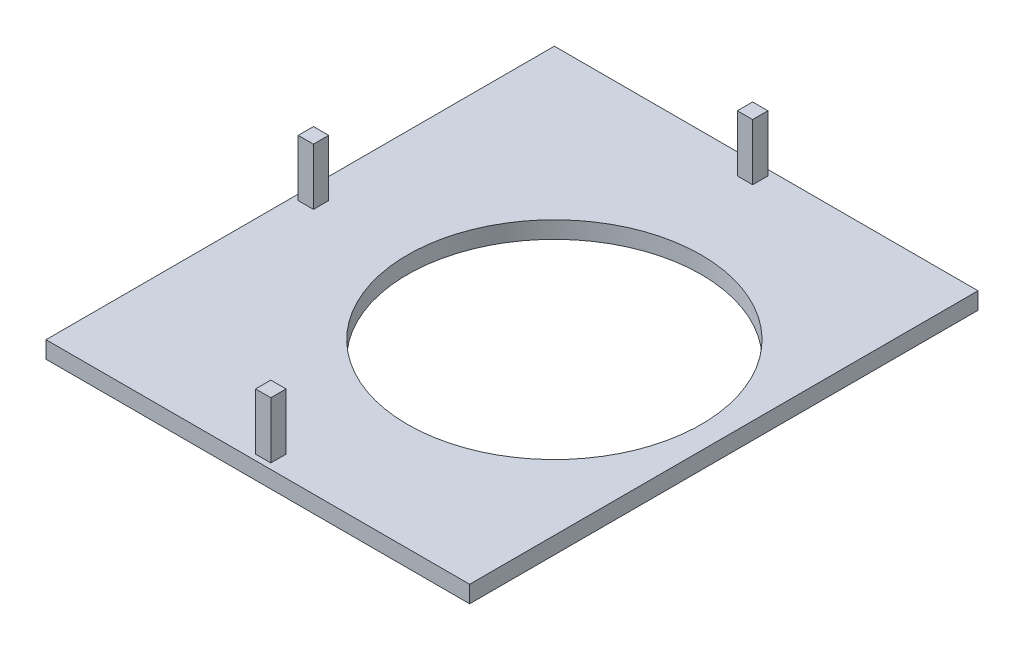
ISO-10303-21;
HEADER;
FILE_DESCRIPTION(('STEP AP214'),'2;1');
FILE_NAME('part.step','',(''),(''),'','','');
FILE_SCHEMA(('AUTOMOTIVE_DESIGN { 1 0 10303 214 1 1 1 1 }'));
ENDSEC;
DATA;
#1=APPLICATION_CONTEXT('core data for automotive mechanical design processes');
#2=APPLICATION_PROTOCOL_DEFINITION('international standard','automotive_design',2000,#1);
#3=PRODUCT_CONTEXT('',#1,'mechanical');
#4=PRODUCT('Part','Part','',(#3));
#5=PRODUCT_RELATED_PRODUCT_CATEGORY('part','',(#4));
#6=PRODUCT_DEFINITION_FORMATION('','',#4);
#7=PRODUCT_DEFINITION_CONTEXT('part definition',#1,'design');
#8=PRODUCT_DEFINITION('design','',#6,#7);
#9=PRODUCT_DEFINITION_SHAPE('','',#8);
#10=(LENGTH_UNIT() NAMED_UNIT(*) SI_UNIT(.MILLI.,.METRE.));
#11=(NAMED_UNIT(*) PLANE_ANGLE_UNIT() SI_UNIT($,.RADIAN.));
#12=(NAMED_UNIT(*) SI_UNIT($,.STERADIAN.) SOLID_ANGLE_UNIT());
#13=UNCERTAINTY_MEASURE_WITH_UNIT(LENGTH_MEASURE(1.E-05),#10,'distance_accuracy_value','');
#14=(GEOMETRIC_REPRESENTATION_CONTEXT(3) GLOBAL_UNCERTAINTY_ASSIGNED_CONTEXT((#13)) GLOBAL_UNIT_ASSIGNED_CONTEXT((#10,
#11,#12)) REPRESENTATION_CONTEXT('',''));
#15=CARTESIAN_POINT('',(0.,0.,0.));
#16=DIRECTION('',(0.,0.,1.));
#17=DIRECTION('',(1.,0.,0.));
#18=AXIS2_PLACEMENT_3D('',#15,#16,#17);
#19=CARTESIAN_POINT('',(0.,3.,0.));
#20=DIRECTION('',(0.,1.,0.));
#21=DIRECTION('',(0.,0.,1.));
#22=AXIS2_PLACEMENT_3D('',#19,#20,#21);
#23=PLANE('',#22);
#24=CARTESIAN_POINT('',(45.,3.,45.));
#25=DIRECTION('',(0.,1.,0.));
#26=DIRECTION('',(0.,0.,1.));
#27=AXIS2_PLACEMENT_3D('',#24,#25,#26);
#28=CIRCLE('',#27,26.);
#29=CARTESIAN_POINT('',(45.,3.,71.));
#30=VERTEX_POINT('',#29);
#31=EDGE_CURVE('E535',#30,#30,#28,.T.);
#32=ORIENTED_EDGE('',*,*,#31,.F.);
#33=EDGE_LOOP('',(#32));
#34=FACE_BOUND('',#33,.T.);
#35=DIRECTION('',(0.,0.,1.));
#36=VECTOR('',#35,1.);
#37=CARTESIAN_POINT('',(0.,3.,0.));
#38=LINE('',#37,#36);
#39=CARTESIAN_POINT('',(0.,3.,0.));
#40=VERTEX_POINT('',#39);
#41=CARTESIAN_POINT('',(0.,3.,90.));
#42=VERTEX_POINT('',#41);
#43=EDGE_CURVE('E279',#40,#42,#38,.T.);
#44=ORIENTED_EDGE('',*,*,#43,.T.);
#45=DIRECTION('',(1.,0.,0.));
#46=VECTOR('',#45,1.);
#47=CARTESIAN_POINT('',(0.,3.,90.));
#48=LINE('',#47,#46);
#49=CARTESIAN_POINT('',(75.,3.,90.));
#50=VERTEX_POINT('',#49);
#51=EDGE_CURVE('E283',#42,#50,#48,.T.);
#52=ORIENTED_EDGE('',*,*,#51,.T.);
#53=DIRECTION('',(0.,0.,-1.));
#54=VECTOR('',#53,1.);
#55=CARTESIAN_POINT('',(75.,3.,0.));
#56=LINE('',#55,#54);
#57=CARTESIAN_POINT('',(75.,3.,0.));
#58=VERTEX_POINT('',#57);
#59=EDGE_CURVE('E287',#50,#58,#56,.T.);
#60=ORIENTED_EDGE('',*,*,#59,.T.);
#61=DIRECTION('',(-1.,0.,0.));
#62=VECTOR('',#61,1.);
#63=CARTESIAN_POINT('',(0.,3.,0.));
#64=LINE('',#63,#62);
#65=EDGE_CURVE('E290',#58,#40,#64,.T.);
#66=ORIENTED_EDGE('',*,*,#65,.T.);
#67=EDGE_LOOP('',(#44,#52,#60,#66));
#68=FACE_BOUND('',#67,.T.);
#69=DIRECTION('',(1.,0.,0.));
#70=VECTOR('',#69,1.);
#71=CARTESIAN_POINT('',(36.1,3.,89.));
#72=LINE('',#71,#70);
#73=CARTESIAN_POINT('',(36.1,3.,89.));
#74=VERTEX_POINT('',#73);
#75=CARTESIAN_POINT('',(38.8,3.,89.));
#76=VERTEX_POINT('',#75);
#77=EDGE_CURVE('E262',#74,#76,#72,.T.);
#78=ORIENTED_EDGE('',*,*,#77,.F.);
#79=DIRECTION('',(0.,0.,1.));
#80=VECTOR('',#79,1.);
#81=CARTESIAN_POINT('',(36.1,3.,86.3));
#82=LINE('',#81,#80);
#83=CARTESIAN_POINT('',(36.1,3.,86.3));
#84=VERTEX_POINT('',#83);
#85=EDGE_CURVE('E202',#84,#74,#82,.T.);
#86=ORIENTED_EDGE('',*,*,#85,.F.);
#87=DIRECTION('',(-1.,0.,0.));
#88=VECTOR('',#87,1.);
#89=CARTESIAN_POINT('',(36.1,3.,86.3));
#90=LINE('',#89,#88);
#91=CARTESIAN_POINT('',(38.8,3.,86.3));
#92=VERTEX_POINT('',#91);
#93=EDGE_CURVE('E254',#92,#84,#90,.T.);
#94=ORIENTED_EDGE('',*,*,#93,.F.);
#95=DIRECTION('',(0.,0.,-1.));
#96=VECTOR('',#95,1.);
#97=CARTESIAN_POINT('',(38.8,3.,86.3));
#98=LINE('',#97,#96);
#99=EDGE_CURVE('E257',#76,#92,#98,.T.);
#100=ORIENTED_EDGE('',*,*,#99,.F.);
#101=EDGE_LOOP('',(#78,#86,#94,#100));
#102=FACE_BOUND('',#101,.T.);
#103=DIRECTION('',(1.,0.,0.));
#104=VECTOR('',#103,1.);
#105=CARTESIAN_POINT('',(1.,3.,46.35));
#106=LINE('',#105,#104);
#107=CARTESIAN_POINT('',(1.,3.,46.35));
#108=VERTEX_POINT('',#107);
#109=CARTESIAN_POINT('',(3.7,3.,46.35));
#110=VERTEX_POINT('',#109);
#111=EDGE_CURVE('E220',#108,#110,#106,.T.);
#112=ORIENTED_EDGE('',*,*,#111,.F.);
#113=DIRECTION('',(0.,0.,1.));
#114=VECTOR('',#113,1.);
#115=CARTESIAN_POINT('',(1.,3.,43.65));
#116=LINE('',#115,#114);
#117=CARTESIAN_POINT('',(1.,3.,43.65));
#118=VERTEX_POINT('',#117);
#119=EDGE_CURVE('E223',#118,#108,#116,.T.);
#120=ORIENTED_EDGE('',*,*,#119,.F.);
#121=DIRECTION('',(-1.,0.,0.));
#122=VECTOR('',#121,1.);
#123=CARTESIAN_POINT('',(1.,3.,43.65));
#124=LINE('',#123,#122);
#125=CARTESIAN_POINT('',(3.7,3.,43.65));
#126=VERTEX_POINT('',#125);
#127=EDGE_CURVE('E213',#126,#118,#124,.T.);
#128=ORIENTED_EDGE('',*,*,#127,.F.);
#129=DIRECTION('',(0.,0.,-1.));
#130=VECTOR('',#129,1.);
#131=CARTESIAN_POINT('',(3.7,3.,43.65));
#132=LINE('',#131,#130);
#133=EDGE_CURVE('E216',#110,#126,#132,.T.);
#134=ORIENTED_EDGE('',*,*,#133,.F.);
#135=EDGE_LOOP('',(#112,#120,#128,#134));
#136=FACE_BOUND('',#135,.T.);
#137=DIRECTION('',(1.,0.,0.));
#138=VECTOR('',#137,1.);
#139=CARTESIAN_POINT('',(36.1,3.,3.7));
#140=LINE('',#139,#138);
#141=CARTESIAN_POINT('',(36.1,3.,3.7));
#142=VERTEX_POINT('',#141);
#143=CARTESIAN_POINT('',(38.8,3.,3.7));
#144=VERTEX_POINT('',#143);
#145=EDGE_CURVE('E548',#142,#144,#140,.T.);
#146=ORIENTED_EDGE('',*,*,#145,.F.);
#147=DIRECTION('',(0.,0.,1.));
#148=VECTOR('',#147,1.);
#149=CARTESIAN_POINT('',(36.1,3.,0.999999999999996));
#150=LINE('',#149,#148);
#151=CARTESIAN_POINT('',(36.1,3.,0.999999999999996));
#152=VERTEX_POINT('',#151);
#153=EDGE_CURVE('E185',#152,#142,#150,.T.);
#154=ORIENTED_EDGE('',*,*,#153,.F.);
#155=DIRECTION('',(-1.,0.,0.));
#156=VECTOR('',#155,1.);
#157=CARTESIAN_POINT('',(36.1,3.,0.999999999999996));
#158=LINE('',#157,#156);
#159=CARTESIAN_POINT('',(38.8,3.,0.999999999999996));
#160=VERTEX_POINT('',#159);
#161=EDGE_CURVE('E181',#160,#152,#158,.T.);
#162=ORIENTED_EDGE('',*,*,#161,.F.);
#163=DIRECTION('',(0.,0.,-1.));
#164=VECTOR('',#163,1.);
#165=CARTESIAN_POINT('',(38.8,3.,0.999999999999996));
#166=LINE('',#165,#164);
#167=EDGE_CURVE('E551',#144,#160,#166,.T.);
#168=ORIENTED_EDGE('',*,*,#167,.F.);
#169=EDGE_LOOP('',(#146,#154,#162,#168));
#170=FACE_BOUND('',#169,.T.);
#171=ADVANCED_FACE('F45',(#34,#68,#102,#136,#170),#23,.T.);
#172=CARTESIAN_POINT('',(0.,3.,0.));
#173=DIRECTION('',(1.,0.,0.));
#174=DIRECTION('',(0.,0.,-1.));
#175=AXIS2_PLACEMENT_3D('',#172,#173,#174);
#176=PLANE('',#175);
#177=DIRECTION('',(0.,0.,1.));
#178=VECTOR('',#177,1.);
#179=CARTESIAN_POINT('',(0.,0.,0.));
#180=LINE('',#179,#178);
#181=CARTESIAN_POINT('',(0.,0.,0.));
#182=VERTEX_POINT('',#181);
#183=CARTESIAN_POINT('',(0.,0.,90.));
#184=VERTEX_POINT('',#183);
#185=EDGE_CURVE('E188',#182,#184,#180,.T.);
#186=ORIENTED_EDGE('',*,*,#185,.T.);
#187=DIRECTION('',(0.,-1.,0.));
#188=VECTOR('',#187,1.);
#189=CARTESIAN_POINT('',(0.,3.,90.));
#190=LINE('',#189,#188);
#191=EDGE_CURVE('E11',#42,#184,#190,.T.);
#192=ORIENTED_EDGE('',*,*,#191,.F.);
#193=ORIENTED_EDGE('',*,*,#43,.F.);
#194=DIRECTION('',(0.,-1.,0.));
#195=VECTOR('',#194,1.);
#196=CARTESIAN_POINT('',(0.,3.,0.));
#197=LINE('',#196,#195);
#198=EDGE_CURVE('E292',#40,#182,#197,.T.);
#199=ORIENTED_EDGE('',*,*,#198,.T.);
#200=EDGE_LOOP('',(#186,#192,#193,#199));
#201=FACE_BOUND('',#200,.T.);
#202=ADVANCED_FACE('F47',(#201),#176,.F.);
#203=CARTESIAN_POINT('',(0.,3.,90.));
#204=DIRECTION('',(0.,0.,-1.));
#205=DIRECTION('',(-1.,0.,0.));
#206=AXIS2_PLACEMENT_3D('',#203,#204,#205);
#207=PLANE('',#206);
#208=DIRECTION('',(1.,0.,0.));
#209=VECTOR('',#208,1.);
#210=CARTESIAN_POINT('',(0.,0.,90.));
#211=LINE('',#210,#209);
#212=CARTESIAN_POINT('',(75.,0.,90.));
#213=VERTEX_POINT('',#212);
#214=EDGE_CURVE('E193',#184,#213,#211,.T.);
#215=ORIENTED_EDGE('',*,*,#214,.T.);
#216=DIRECTION('',(0.,-1.,0.));
#217=VECTOR('',#216,1.);
#218=CARTESIAN_POINT('',(75.,3.,90.));
#219=LINE('',#218,#217);
#220=EDGE_CURVE('E54',#50,#213,#219,.T.);
#221=ORIENTED_EDGE('',*,*,#220,.F.);
#222=ORIENTED_EDGE('',*,*,#51,.F.);
#223=ORIENTED_EDGE('',*,*,#191,.T.);
#224=EDGE_LOOP('',(#215,#221,#222,#223));
#225=FACE_BOUND('',#224,.T.);
#226=ADVANCED_FACE('F329',(#225),#207,.F.);
#227=CARTESIAN_POINT('',(75.,3.,0.));
#228=DIRECTION('',(-1.,0.,0.));
#229=DIRECTION('',(0.,0.,1.));
#230=AXIS2_PLACEMENT_3D('',#227,#228,#229);
#231=PLANE('',#230);
#232=DIRECTION('',(0.,0.,-1.));
#233=VECTOR('',#232,1.);
#234=CARTESIAN_POINT('',(75.,0.,0.));
#235=LINE('',#234,#233);
#236=CARTESIAN_POINT('',(75.,0.,0.));
#237=VERTEX_POINT('',#236);
#238=EDGE_CURVE('E296',#213,#237,#235,.T.);
#239=ORIENTED_EDGE('',*,*,#238,.T.);
#240=DIRECTION('',(0.,-1.,0.));
#241=VECTOR('',#240,1.);
#242=CARTESIAN_POINT('',(75.,3.,0.));
#243=LINE('',#242,#241);
#244=EDGE_CURVE('E304',#58,#237,#243,.T.);
#245=ORIENTED_EDGE('',*,*,#244,.F.);
#246=ORIENTED_EDGE('',*,*,#59,.F.);
#247=ORIENTED_EDGE('',*,*,#220,.T.);
#248=EDGE_LOOP('',(#239,#245,#246,#247));
#249=FACE_BOUND('',#248,.T.);
#250=ADVANCED_FACE('F313',(#249),#231,.F.);
#251=CARTESIAN_POINT('',(0.,3.,0.));
#252=DIRECTION('',(0.,0.,1.));
#253=DIRECTION('',(1.,0.,0.));
#254=AXIS2_PLACEMENT_3D('',#251,#252,#253);
#255=PLANE('',#254);
#256=DIRECTION('',(-1.,0.,0.));
#257=VECTOR('',#256,1.);
#258=CARTESIAN_POINT('',(0.,0.,0.));
#259=LINE('',#258,#257);
#260=EDGE_CURVE('E284',#237,#182,#259,.T.);
#261=ORIENTED_EDGE('',*,*,#260,.T.);
#262=ORIENTED_EDGE('',*,*,#198,.F.);
#263=ORIENTED_EDGE('',*,*,#65,.F.);
#264=ORIENTED_EDGE('',*,*,#244,.T.);
#265=EDGE_LOOP('',(#261,#262,#263,#264));
#266=FACE_BOUND('',#265,.T.);
#267=ADVANCED_FACE('F322',(#266),#255,.F.);
#268=CARTESIAN_POINT('',(0.,0.,0.));
#269=DIRECTION('',(0.,1.,0.));
#270=DIRECTION('',(0.,0.,1.));
#271=AXIS2_PLACEMENT_3D('',#268,#269,#270);
#272=PLANE('',#271);
#273=CARTESIAN_POINT('',(45.,0.,45.));
#274=DIRECTION('',(0.,1.,0.));
#275=DIRECTION('',(0.,0.,1.));
#276=AXIS2_PLACEMENT_3D('',#273,#274,#275);
#277=CIRCLE('',#276,26.);
#278=CARTESIAN_POINT('',(45.,0.,71.));
#279=VERTEX_POINT('',#278);
#280=EDGE_CURVE('E242',#279,#279,#277,.F.);
#281=ORIENTED_EDGE('',*,*,#280,.F.);
#282=EDGE_LOOP('',(#281));
#283=FACE_BOUND('',#282,.T.);
#284=ORIENTED_EDGE('',*,*,#185,.F.);
#285=ORIENTED_EDGE('',*,*,#260,.F.);
#286=ORIENTED_EDGE('',*,*,#238,.F.);
#287=ORIENTED_EDGE('',*,*,#214,.F.);
#288=EDGE_LOOP('',(#284,#285,#286,#287));
#289=FACE_BOUND('',#288,.T.);
#290=ADVANCED_FACE('F319',(#283,#289),#272,.F.);
#291=CARTESIAN_POINT('',(36.1,13.,86.3));
#292=DIRECTION('',(1.,0.,0.));
#293=DIRECTION('',(0.,0.,-1.));
#294=AXIS2_PLACEMENT_3D('',#291,#292,#293);
#295=PLANE('',#294);
#296=ORIENTED_EDGE('',*,*,#85,.T.);
#297=DIRECTION('',(0.,-1.,0.));
#298=VECTOR('',#297,1.);
#299=CARTESIAN_POINT('',(36.1,13.,89.));
#300=LINE('',#299,#298);
#301=CARTESIAN_POINT('',(36.1,13.,89.));
#302=VERTEX_POINT('',#301);
#303=EDGE_CURVE('E238',#302,#74,#300,.T.);
#304=ORIENTED_EDGE('',*,*,#303,.F.);
#305=DIRECTION('',(0.,0.,1.));
#306=VECTOR('',#305,1.);
#307=CARTESIAN_POINT('',(36.1,13.,86.3));
#308=LINE('',#307,#306);
#309=CARTESIAN_POINT('',(36.1,13.,86.3));
#310=VERTEX_POINT('',#309);
#311=EDGE_CURVE('E258',#310,#302,#308,.T.);
#312=ORIENTED_EDGE('',*,*,#311,.F.);
#313=DIRECTION('',(0.,-1.,0.));
#314=VECTOR('',#313,1.);
#315=CARTESIAN_POINT('',(36.1,13.,86.3));
#316=LINE('',#315,#314);
#317=EDGE_CURVE('E249',#310,#84,#316,.T.);
#318=ORIENTED_EDGE('',*,*,#317,.T.);
#319=EDGE_LOOP('',(#296,#304,#312,#318));
#320=FACE_BOUND('',#319,.T.);
#321=ADVANCED_FACE('F349',(#320),#295,.F.);
#322=CARTESIAN_POINT('',(36.1,13.,89.));
#323=DIRECTION('',(0.,0.,-1.));
#324=DIRECTION('',(-1.,0.,0.));
#325=AXIS2_PLACEMENT_3D('',#322,#323,#324);
#326=PLANE('',#325);
#327=ORIENTED_EDGE('',*,*,#77,.T.);
#328=DIRECTION('',(0.,-1.,0.));
#329=VECTOR('',#328,1.);
#330=CARTESIAN_POINT('',(38.8,13.,89.));
#331=LINE('',#330,#329);
#332=CARTESIAN_POINT('',(38.8,13.,89.));
#333=VERTEX_POINT('',#332);
#334=EDGE_CURVE('E241',#333,#76,#331,.T.);
#335=ORIENTED_EDGE('',*,*,#334,.F.);
#336=DIRECTION('',(1.,0.,0.));
#337=VECTOR('',#336,1.);
#338=CARTESIAN_POINT('',(36.1,13.,89.));
#339=LINE('',#338,#337);
#340=EDGE_CURVE('E273',#302,#333,#339,.T.);
#341=ORIENTED_EDGE('',*,*,#340,.F.);
#342=ORIENTED_EDGE('',*,*,#303,.T.);
#343=EDGE_LOOP('',(#327,#335,#341,#342));
#344=FACE_BOUND('',#343,.T.);
#345=ADVANCED_FACE('F364',(#344),#326,.F.);
#346=CARTESIAN_POINT('',(38.8,13.,86.3));
#347=DIRECTION('',(-1.,0.,0.));
#348=DIRECTION('',(0.,0.,1.));
#349=AXIS2_PLACEMENT_3D('',#346,#347,#348);
#350=PLANE('',#349);
#351=ORIENTED_EDGE('',*,*,#99,.T.);
#352=DIRECTION('',(0.,-1.,0.));
#353=VECTOR('',#352,1.);
#354=CARTESIAN_POINT('',(38.8,13.,86.3));
#355=LINE('',#354,#353);
#356=CARTESIAN_POINT('',(38.8,13.,86.3));
#357=VERTEX_POINT('',#356);
#358=EDGE_CURVE('E246',#357,#92,#355,.T.);
#359=ORIENTED_EDGE('',*,*,#358,.F.);
#360=DIRECTION('',(0.,0.,-1.));
#361=VECTOR('',#360,1.);
#362=CARTESIAN_POINT('',(38.8,13.,86.3));
#363=LINE('',#362,#361);
#364=EDGE_CURVE('E270',#333,#357,#363,.T.);
#365=ORIENTED_EDGE('',*,*,#364,.F.);
#366=ORIENTED_EDGE('',*,*,#334,.T.);
#367=EDGE_LOOP('',(#351,#359,#365,#366));
#368=FACE_BOUND('',#367,.T.);
#369=ADVANCED_FACE('F374',(#368),#350,.F.);
#370=CARTESIAN_POINT('',(36.1,13.,86.3));
#371=DIRECTION('',(0.,0.,1.));
#372=DIRECTION('',(1.,0.,0.));
#373=AXIS2_PLACEMENT_3D('',#370,#371,#372);
#374=PLANE('',#373);
#375=ORIENTED_EDGE('',*,*,#93,.T.);
#376=ORIENTED_EDGE('',*,*,#317,.F.);
#377=DIRECTION('',(-1.,0.,0.));
#378=VECTOR('',#377,1.);
#379=CARTESIAN_POINT('',(36.1,13.,86.3));
#380=LINE('',#379,#378);
#381=EDGE_CURVE('E253',#357,#310,#380,.T.);
#382=ORIENTED_EDGE('',*,*,#381,.F.);
#383=ORIENTED_EDGE('',*,*,#358,.T.);
#384=EDGE_LOOP('',(#375,#376,#382,#383));
#385=FACE_BOUND('',#384,.T.);
#386=ADVANCED_FACE('F383',(#385),#374,.F.);
#387=CARTESIAN_POINT('',(0.,13.,0.));
#388=DIRECTION('',(0.,1.,0.));
#389=DIRECTION('',(0.,0.,1.));
#390=AXIS2_PLACEMENT_3D('',#387,#388,#389);
#391=PLANE('',#390);
#392=ORIENTED_EDGE('',*,*,#311,.T.);
#393=ORIENTED_EDGE('',*,*,#340,.T.);
#394=ORIENTED_EDGE('',*,*,#364,.T.);
#395=ORIENTED_EDGE('',*,*,#381,.T.);
#396=EDGE_LOOP('',(#392,#393,#394,#395));
#397=FACE_BOUND('',#396,.T.);
#398=ADVANCED_FACE('F346',(#397),#391,.T.);
#399=CARTESIAN_POINT('',(1.,13.,43.65));
#400=DIRECTION('',(1.,0.,0.));
#401=DIRECTION('',(0.,0.,-1.));
#402=AXIS2_PLACEMENT_3D('',#399,#400,#401);
#403=PLANE('',#402);
#404=ORIENTED_EDGE('',*,*,#119,.T.);
#405=DIRECTION('',(0.,-1.,0.));
#406=VECTOR('',#405,1.);
#407=CARTESIAN_POINT('',(1.,13.,46.35));
#408=LINE('',#407,#406);
#409=CARTESIAN_POINT('',(1.,13.,46.35));
#410=VERTEX_POINT('',#409);
#411=EDGE_CURVE('E198',#410,#108,#408,.T.);
#412=ORIENTED_EDGE('',*,*,#411,.F.);
#413=DIRECTION('',(0.,0.,1.));
#414=VECTOR('',#413,1.);
#415=CARTESIAN_POINT('',(1.,13.,43.65));
#416=LINE('',#415,#414);
#417=CARTESIAN_POINT('',(1.,13.,43.65));
#418=VERTEX_POINT('',#417);
#419=EDGE_CURVE('E217',#418,#410,#416,.T.);
#420=ORIENTED_EDGE('',*,*,#419,.F.);
#421=DIRECTION('',(0.,-1.,0.));
#422=VECTOR('',#421,1.);
#423=CARTESIAN_POINT('',(1.,13.,43.65));
#424=LINE('',#423,#422);
#425=EDGE_CURVE('E208',#418,#118,#424,.T.);
#426=ORIENTED_EDGE('',*,*,#425,.T.);
#427=EDGE_LOOP('',(#404,#412,#420,#426));
#428=FACE_BOUND('',#427,.T.);
#429=ADVANCED_FACE('F399',(#428),#403,.F.);
#430=CARTESIAN_POINT('',(1.,13.,46.35));
#431=DIRECTION('',(0.,0.,-1.));
#432=DIRECTION('',(-1.,0.,0.));
#433=AXIS2_PLACEMENT_3D('',#430,#431,#432);
#434=PLANE('',#433);
#435=ORIENTED_EDGE('',*,*,#111,.T.);
#436=DIRECTION('',(0.,-1.,0.));
#437=VECTOR('',#436,1.);
#438=CARTESIAN_POINT('',(3.7,13.,46.35));
#439=LINE('',#438,#437);
#440=CARTESIAN_POINT('',(3.7,13.,46.35));
#441=VERTEX_POINT('',#440);
#442=EDGE_CURVE('E201',#441,#110,#439,.T.);
#443=ORIENTED_EDGE('',*,*,#442,.F.);
#444=DIRECTION('',(1.,0.,0.));
#445=VECTOR('',#444,1.);
#446=CARTESIAN_POINT('',(1.,13.,46.35));
#447=LINE('',#446,#445);
#448=EDGE_CURVE('E232',#410,#441,#447,.T.);
#449=ORIENTED_EDGE('',*,*,#448,.F.);
#450=ORIENTED_EDGE('',*,*,#411,.T.);
#451=EDGE_LOOP('',(#435,#443,#449,#450));
#452=FACE_BOUND('',#451,.T.);
#453=ADVANCED_FACE('F407',(#452),#434,.F.);
#454=CARTESIAN_POINT('',(3.7,13.,43.65));
#455=DIRECTION('',(-1.,0.,0.));
#456=DIRECTION('',(0.,0.,1.));
#457=AXIS2_PLACEMENT_3D('',#454,#455,#456);
#458=PLANE('',#457);
#459=ORIENTED_EDGE('',*,*,#133,.T.);
#460=DIRECTION('',(0.,-1.,0.));
#461=VECTOR('',#460,1.);
#462=CARTESIAN_POINT('',(3.7,13.,43.65));
#463=LINE('',#462,#461);
#464=CARTESIAN_POINT('',(3.7,13.,43.65));
#465=VERTEX_POINT('',#464);
#466=EDGE_CURVE('E69',#465,#126,#463,.T.);
#467=ORIENTED_EDGE('',*,*,#466,.F.);
#468=DIRECTION('',(0.,0.,-1.));
#469=VECTOR('',#468,1.);
#470=CARTESIAN_POINT('',(3.7,13.,43.65));
#471=LINE('',#470,#469);
#472=EDGE_CURVE('E229',#441,#465,#471,.T.);
#473=ORIENTED_EDGE('',*,*,#472,.F.);
#474=ORIENTED_EDGE('',*,*,#442,.T.);
#475=EDGE_LOOP('',(#459,#467,#473,#474));
#476=FACE_BOUND('',#475,.T.);
#477=ADVANCED_FACE('F416',(#476),#458,.F.);
#478=CARTESIAN_POINT('',(1.,13.,43.65));
#479=DIRECTION('',(0.,0.,1.));
#480=DIRECTION('',(1.,0.,0.));
#481=AXIS2_PLACEMENT_3D('',#478,#479,#480);
#482=PLANE('',#481);
#483=ORIENTED_EDGE('',*,*,#127,.T.);
#484=ORIENTED_EDGE('',*,*,#425,.F.);
#485=DIRECTION('',(-1.,0.,0.));
#486=VECTOR('',#485,1.);
#487=CARTESIAN_POINT('',(1.,13.,43.65));
#488=LINE('',#487,#486);
#489=EDGE_CURVE('E212',#465,#418,#488,.T.);
#490=ORIENTED_EDGE('',*,*,#489,.F.);
#491=ORIENTED_EDGE('',*,*,#466,.T.);
#492=EDGE_LOOP('',(#483,#484,#490,#491));
#493=FACE_BOUND('',#492,.T.);
#494=ADVANCED_FACE('F425',(#493),#482,.F.);
#495=CARTESIAN_POINT('',(0.,13.,0.));
#496=DIRECTION('',(0.,1.,0.));
#497=DIRECTION('',(0.,0.,1.));
#498=AXIS2_PLACEMENT_3D('',#495,#496,#497);
#499=PLANE('',#498);
#500=ORIENTED_EDGE('',*,*,#419,.T.);
#501=ORIENTED_EDGE('',*,*,#448,.T.);
#502=ORIENTED_EDGE('',*,*,#472,.T.);
#503=ORIENTED_EDGE('',*,*,#489,.T.);
#504=EDGE_LOOP('',(#500,#501,#502,#503));
#505=FACE_BOUND('',#504,.T.);
#506=ADVANCED_FACE('F434',(#505),#499,.T.);
#507=CARTESIAN_POINT('',(36.1,13.,0.999999999999996));
#508=DIRECTION('',(1.,0.,0.));
#509=DIRECTION('',(0.,0.,-1.));
#510=AXIS2_PLACEMENT_3D('',#507,#508,#509);
#511=PLANE('',#510);
#512=ORIENTED_EDGE('',*,*,#153,.T.);
#513=DIRECTION('',(0.,-1.,0.));
#514=VECTOR('',#513,1.);
#515=CARTESIAN_POINT('',(36.1,13.,3.7));
#516=LINE('',#515,#514);
#517=CARTESIAN_POINT('',(36.1,13.,3.7));
#518=VERTEX_POINT('',#517);
#519=EDGE_CURVE('E164',#518,#142,#516,.T.);
#520=ORIENTED_EDGE('',*,*,#519,.F.);
#521=DIRECTION('',(0.,0.,1.));
#522=VECTOR('',#521,1.);
#523=CARTESIAN_POINT('',(36.1,13.,0.999999999999996));
#524=LINE('',#523,#522);
#525=CARTESIAN_POINT('',(36.1,13.,0.999999999999996));
#526=VERTEX_POINT('',#525);
#527=EDGE_CURVE('E172',#526,#518,#524,.T.);
#528=ORIENTED_EDGE('',*,*,#527,.F.);
#529=DIRECTION('',(0.,-1.,0.));
#530=VECTOR('',#529,1.);
#531=CARTESIAN_POINT('',(36.1,13.,0.999999999999996));
#532=LINE('',#531,#530);
#533=EDGE_CURVE('E545',#526,#152,#532,.T.);
#534=ORIENTED_EDGE('',*,*,#533,.T.);
#535=EDGE_LOOP('',(#512,#520,#528,#534));
#536=FACE_BOUND('',#535,.T.);
#537=ADVANCED_FACE('F183',(#536),#511,.F.);
#538=CARTESIAN_POINT('',(36.1,13.,3.7));
#539=DIRECTION('',(0.,0.,-1.));
#540=DIRECTION('',(-1.,0.,0.));
#541=AXIS2_PLACEMENT_3D('',#538,#539,#540);
#542=PLANE('',#541);
#543=ORIENTED_EDGE('',*,*,#145,.T.);
#544=DIRECTION('',(0.,-1.,0.));
#545=VECTOR('',#544,1.);
#546=CARTESIAN_POINT('',(38.8,13.,3.7));
#547=LINE('',#546,#545);
#548=CARTESIAN_POINT('',(38.8,13.,3.7));
#549=VERTEX_POINT('',#548);
#550=EDGE_CURVE('E167',#549,#144,#547,.T.);
#551=ORIENTED_EDGE('',*,*,#550,.F.);
#552=DIRECTION('',(1.,0.,0.));
#553=VECTOR('',#552,1.);
#554=CARTESIAN_POINT('',(36.1,13.,3.7));
#555=LINE('',#554,#553);
#556=EDGE_CURVE('E160',#518,#549,#555,.T.);
#557=ORIENTED_EDGE('',*,*,#556,.F.);
#558=ORIENTED_EDGE('',*,*,#519,.T.);
#559=EDGE_LOOP('',(#543,#551,#557,#558));
#560=FACE_BOUND('',#559,.T.);
#561=ADVANCED_FACE('F162',(#560),#542,.F.);
#562=CARTESIAN_POINT('',(38.8,13.,0.999999999999996));
#563=DIRECTION('',(-1.,0.,0.));
#564=DIRECTION('',(0.,0.,1.));
#565=AXIS2_PLACEMENT_3D('',#562,#563,#564);
#566=PLANE('',#565);
#567=ORIENTED_EDGE('',*,*,#167,.T.);
#568=DIRECTION('',(0.,-1.,0.));
#569=VECTOR('',#568,1.);
#570=CARTESIAN_POINT('',(38.8,13.,0.999999999999996));
#571=LINE('',#570,#569);
#572=CARTESIAN_POINT('',(38.8,13.,0.999999999999996));
#573=VERTEX_POINT('',#572);
#574=EDGE_CURVE('E61',#573,#160,#571,.T.);
#575=ORIENTED_EDGE('',*,*,#574,.F.);
#576=DIRECTION('',(0.,0.,-1.));
#577=VECTOR('',#576,1.);
#578=CARTESIAN_POINT('',(38.8,13.,0.999999999999996));
#579=LINE('',#578,#577);
#580=EDGE_CURVE('E171',#549,#573,#579,.T.);
#581=ORIENTED_EDGE('',*,*,#580,.F.);
#582=ORIENTED_EDGE('',*,*,#550,.T.);
#583=EDGE_LOOP('',(#567,#575,#581,#582));
#584=FACE_BOUND('',#583,.T.);
#585=ADVANCED_FACE('F457',(#584),#566,.F.);
#586=CARTESIAN_POINT('',(36.1,13.,0.999999999999996));
#587=DIRECTION('',(0.,0.,1.));
#588=DIRECTION('',(1.,0.,0.));
#589=AXIS2_PLACEMENT_3D('',#586,#587,#588);
#590=PLANE('',#589);
#591=ORIENTED_EDGE('',*,*,#161,.T.);
#592=ORIENTED_EDGE('',*,*,#533,.F.);
#593=DIRECTION('',(-1.,0.,0.));
#594=VECTOR('',#593,1.);
#595=CARTESIAN_POINT('',(36.1,13.,0.999999999999996));
#596=LINE('',#595,#594);
#597=EDGE_CURVE('E176',#573,#526,#596,.T.);
#598=ORIENTED_EDGE('',*,*,#597,.F.);
#599=ORIENTED_EDGE('',*,*,#574,.T.);
#600=EDGE_LOOP('',(#591,#592,#598,#599));
#601=FACE_BOUND('',#600,.T.);
#602=ADVANCED_FACE('F465',(#601),#590,.F.);
#603=CARTESIAN_POINT('',(0.,13.,0.));
#604=DIRECTION('',(0.,1.,0.));
#605=DIRECTION('',(0.,0.,1.));
#606=AXIS2_PLACEMENT_3D('',#603,#604,#605);
#607=PLANE('',#606);
#608=ORIENTED_EDGE('',*,*,#527,.T.);
#609=ORIENTED_EDGE('',*,*,#556,.T.);
#610=ORIENTED_EDGE('',*,*,#580,.T.);
#611=ORIENTED_EDGE('',*,*,#597,.T.);
#612=EDGE_LOOP('',(#608,#609,#610,#611));
#613=FACE_BOUND('',#612,.T.);
#614=ADVANCED_FACE('F175',(#613),#607,.T.);
#615=CARTESIAN_POINT('',(45.,-73.539105243401,45.));
#616=DIRECTION('',(0.,1.,0.));
#617=DIRECTION('',(0.,0.,1.));
#618=AXIS2_PLACEMENT_3D('',#615,#616,#617);
#619=CYLINDRICAL_SURFACE('',#618,26.);
#620=ORIENTED_EDGE('',*,*,#280,.T.);
#621=EDGE_LOOP('',(#620));
#622=FACE_BOUND('',#621,.T.);
#623=ORIENTED_EDGE('',*,*,#31,.T.);
#624=EDGE_LOOP('',(#623));
#625=FACE_BOUND('',#624,.T.);
#626=ADVANCED_FACE('F479',(#622,#625),#619,.F.);
#627=CLOSED_SHELL('',(#171,#202,#226,#250,#267,#290,#321,#345,#369,#386,#398,#429,#453,#477,
#494,#506,#537,#561,#585,#602,#614,#626));
#628=MANIFOLD_SOLID_BREP('B2',#627);
#629=ADVANCED_BREP_SHAPE_REPRESENTATION('',(#18,#628),#14);
#630=SHAPE_DEFINITION_REPRESENTATION(#9,#629);
ENDSEC;
END-ISO-10303-21;
